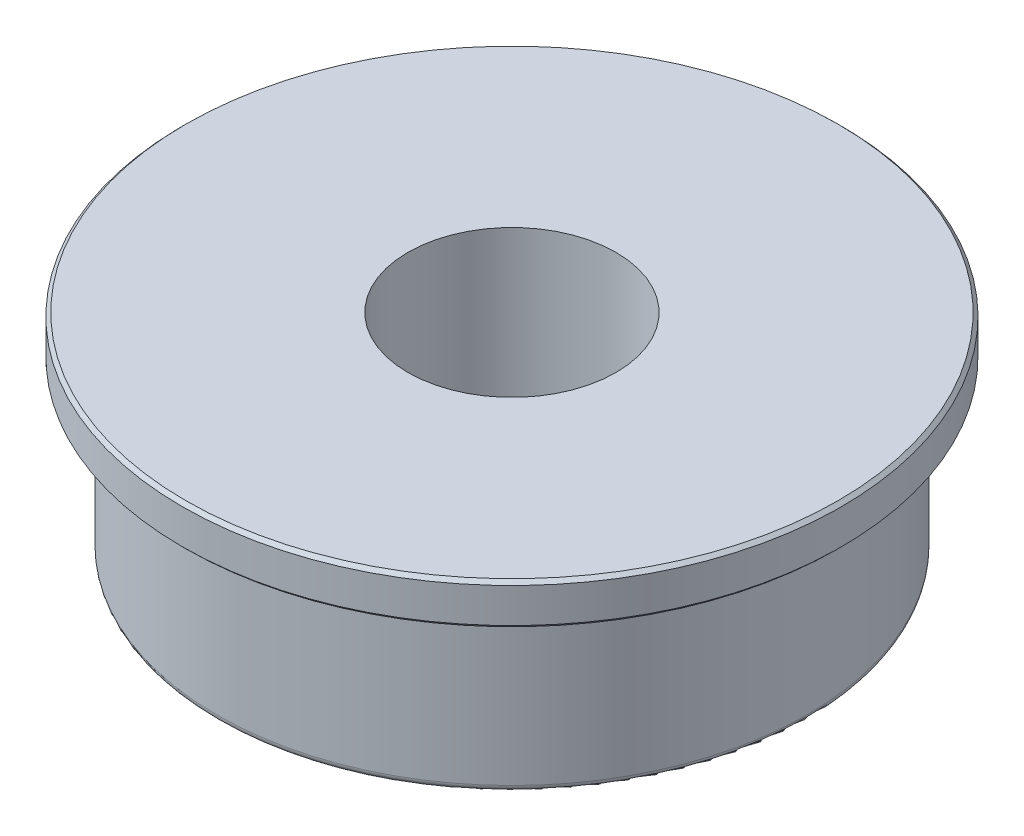
ISO-10303-21;
HEADER;
FILE_DESCRIPTION(('STEP AP214'),'2;1');
FILE_NAME('part.step','',(''),(''),'','','');
FILE_SCHEMA(('AUTOMOTIVE_DESIGN { 1 0 10303 214 1 1 1 1 }'));
ENDSEC;
DATA;
#1=APPLICATION_CONTEXT('core data for automotive mechanical design processes');
#2=APPLICATION_PROTOCOL_DEFINITION('international standard','automotive_design',2000,#1);
#3=PRODUCT_CONTEXT('',#1,'mechanical');
#4=PRODUCT('Part','Part','',(#3));
#5=PRODUCT_RELATED_PRODUCT_CATEGORY('part','',(#4));
#6=PRODUCT_DEFINITION_FORMATION('','',#4);
#7=PRODUCT_DEFINITION_CONTEXT('part definition',#1,'design');
#8=PRODUCT_DEFINITION('design','',#6,#7);
#9=PRODUCT_DEFINITION_SHAPE('','',#8);
#10=(LENGTH_UNIT() NAMED_UNIT(*) SI_UNIT(.MILLI.,.METRE.));
#11=(NAMED_UNIT(*) PLANE_ANGLE_UNIT() SI_UNIT($,.RADIAN.));
#12=(NAMED_UNIT(*) SI_UNIT($,.STERADIAN.) SOLID_ANGLE_UNIT());
#13=UNCERTAINTY_MEASURE_WITH_UNIT(LENGTH_MEASURE(1.E-05),#10,'distance_accuracy_value','');
#14=(GEOMETRIC_REPRESENTATION_CONTEXT(3) GLOBAL_UNCERTAINTY_ASSIGNED_CONTEXT((#13)) GLOBAL_UNIT_ASSIGNED_CONTEXT((#10,
#11,#12)) REPRESENTATION_CONTEXT('',''));
#15=CARTESIAN_POINT('',(0.,0.,0.));
#16=DIRECTION('',(0.,0.,1.));
#17=DIRECTION('',(1.,0.,0.));
#18=AXIS2_PLACEMENT_3D('',#15,#16,#17);
#19=CARTESIAN_POINT('',(0.,6.,0.));
#20=DIRECTION('',(0.,-1.,0.));
#21=DIRECTION('',(0.,0.,-1.));
#22=AXIS2_PLACEMENT_3D('',#19,#20,#21);
#23=CYLINDRICAL_SURFACE('',#22,8.5);
#24=CARTESIAN_POINT('',(0.,0.2,0.));
#25=DIRECTION('',(0.,1.,0.));
#26=DIRECTION('',(0.,0.,1.));
#27=AXIS2_PLACEMENT_3D('',#24,#25,#26);
#28=CIRCLE('',#27,8.5);
#29=CARTESIAN_POINT('',(0.,0.2,8.5));
#30=VERTEX_POINT('',#29);
#31=EDGE_CURVE('E68',#30,#30,#28,.T.);
#32=ORIENTED_EDGE('',*,*,#31,.T.);
#33=EDGE_LOOP('',(#32));
#34=FACE_BOUND('',#33,.T.);
#35=CARTESIAN_POINT('',(0.,4.8,0.));
#36=DIRECTION('',(0.,1.,0.));
#37=DIRECTION('',(0.,0.,1.));
#38=AXIS2_PLACEMENT_3D('',#35,#36,#37);
#39=CIRCLE('',#38,8.5);
#40=CARTESIAN_POINT('',(0.,4.8,8.5));
#41=VERTEX_POINT('',#40);
#42=EDGE_CURVE('E72',#41,#41,#39,.T.);
#43=ORIENTED_EDGE('',*,*,#42,.F.);
#44=EDGE_LOOP('',(#43));
#45=FACE_BOUND('',#44,.T.);
#46=ADVANCED_FACE('F39',(#34,#45),#23,.T.);
#47=CARTESIAN_POINT('',(0.,6.,0.));
#48=DIRECTION('',(0.,1.,0.));
#49=DIRECTION('',(0.,0.,1.));
#50=AXIS2_PLACEMENT_3D('',#47,#48,#49);
#51=PLANE('',#50);
#52=CARTESIAN_POINT('',(0.,6.,0.));
#53=DIRECTION('',(0.,1.,0.));
#54=DIRECTION('',(0.,0.,1.));
#55=AXIS2_PLACEMENT_3D('',#52,#53,#54);
#56=CIRCLE('',#55,9.40000000000001);
#57=CARTESIAN_POINT('',(0.,6.,9.40000000000001));
#58=VERTEX_POINT('',#57);
#59=EDGE_CURVE('E10',#58,#58,#56,.T.);
#60=ORIENTED_EDGE('',*,*,#59,.T.);
#61=EDGE_LOOP('',(#60));
#62=FACE_BOUND('',#61,.T.);
#63=CARTESIAN_POINT('',(0.,6.,0.));
#64=DIRECTION('',(0.,1.,0.));
#65=DIRECTION('',(0.,0.,1.));
#66=AXIS2_PLACEMENT_3D('',#63,#64,#65);
#67=CIRCLE('',#66,3.);
#68=CARTESIAN_POINT('',(0.,6.,3.));
#69=VERTEX_POINT('',#68);
#70=EDGE_CURVE('E77',#69,#69,#67,.T.);
#71=ORIENTED_EDGE('',*,*,#70,.F.);
#72=EDGE_LOOP('',(#71));
#73=FACE_BOUND('',#72,.T.);
#74=ADVANCED_FACE('F88',(#62,#73),#51,.T.);
#75=CARTESIAN_POINT('',(0.,0.,0.));
#76=DIRECTION('',(0.,1.,0.));
#77=DIRECTION('',(0.,0.,1.));
#78=AXIS2_PLACEMENT_3D('',#75,#76,#77);
#79=PLANE('',#78);
#80=CARTESIAN_POINT('',(0.,0.,0.));
#81=DIRECTION('',(0.,1.,0.));
#82=DIRECTION('',(0.,0.,1.));
#83=AXIS2_PLACEMENT_3D('',#80,#81,#82);
#84=CIRCLE('',#83,8.3);
#85=CARTESIAN_POINT('',(0.,0.,8.3));
#86=VERTEX_POINT('',#85);
#87=EDGE_CURVE('E64',#86,#86,#84,.F.);
#88=ORIENTED_EDGE('',*,*,#87,.T.);
#89=EDGE_LOOP('',(#88));
#90=FACE_BOUND('',#89,.T.);
#91=CARTESIAN_POINT('',(0.,0.,0.));
#92=DIRECTION('',(0.,1.,0.));
#93=DIRECTION('',(0.,0.,1.));
#94=AXIS2_PLACEMENT_3D('',#91,#92,#93);
#95=CIRCLE('',#94,3.);
#96=CARTESIAN_POINT('',(0.,0.,3.));
#97=VERTEX_POINT('',#96);
#98=EDGE_CURVE('E73',#97,#97,#95,.T.);
#99=ORIENTED_EDGE('',*,*,#98,.T.);
#100=EDGE_LOOP('',(#99));
#101=FACE_BOUND('',#100,.T.);
#102=ADVANCED_FACE('F94',(#90,#101),#79,.F.);
#103=CARTESIAN_POINT('',(0.,6.,0.));
#104=DIRECTION('',(0.,-1.,0.));
#105=DIRECTION('',(0.,0.,-1.));
#106=AXIS2_PLACEMENT_3D('',#103,#104,#105);
#107=CYLINDRICAL_SURFACE('',#106,3.);
#108=ORIENTED_EDGE('',*,*,#70,.T.);
#109=EDGE_LOOP('',(#108));
#110=FACE_BOUND('',#109,.T.);
#111=ORIENTED_EDGE('',*,*,#98,.F.);
#112=EDGE_LOOP('',(#111));
#113=FACE_BOUND('',#112,.T.);
#114=ADVANCED_FACE('F123',(#110,#113),#107,.F.);
#115=CARTESIAN_POINT('',(0.,4.8,0.));
#116=DIRECTION('',(0.,1.,0.));
#117=DIRECTION('',(0.,0.,1.));
#118=AXIS2_PLACEMENT_3D('',#115,#116,#117);
#119=PLANE('',#118);
#120=CARTESIAN_POINT('',(0.,4.8,0.));
#121=DIRECTION('',(0.,1.,0.));
#122=DIRECTION('',(0.,0.,1.));
#123=AXIS2_PLACEMENT_3D('',#120,#121,#122);
#124=CIRCLE('',#123,9.4);
#125=CARTESIAN_POINT('',(0.,4.8,9.4));
#126=VERTEX_POINT('',#125);
#127=EDGE_CURVE('E48',#126,#126,#124,.F.);
#128=ORIENTED_EDGE('',*,*,#127,.T.);
#129=EDGE_LOOP('',(#128));
#130=FACE_BOUND('',#129,.T.);
#131=ORIENTED_EDGE('',*,*,#42,.T.);
#132=EDGE_LOOP('',(#131));
#133=FACE_BOUND('',#132,.T.);
#134=ADVANCED_FACE('F85',(#130,#133),#119,.F.);
#135=CARTESIAN_POINT('',(0.,4.8,0.));
#136=DIRECTION('',(0.,1.,0.));
#137=DIRECTION('',(0.,0.,1.));
#138=AXIS2_PLACEMENT_3D('',#135,#136,#137);
#139=CYLINDRICAL_SURFACE('',#138,9.5);
#140=CARTESIAN_POINT('',(0.,4.9,0.));
#141=DIRECTION('',(0.,1.,0.));
#142=DIRECTION('',(0.,0.,1.));
#143=AXIS2_PLACEMENT_3D('',#140,#141,#142);
#144=CIRCLE('',#143,9.5);
#145=CARTESIAN_POINT('',(0.,4.9,9.5));
#146=VERTEX_POINT('',#145);
#147=EDGE_CURVE('E53',#146,#146,#144,.T.);
#148=ORIENTED_EDGE('',*,*,#147,.T.);
#149=EDGE_LOOP('',(#148));
#150=FACE_BOUND('',#149,.T.);
#151=CARTESIAN_POINT('',(0.,5.90000000000001,0.));
#152=DIRECTION('',(0.,1.,0.));
#153=DIRECTION('',(0.,0.,1.));
#154=AXIS2_PLACEMENT_3D('',#151,#152,#153);
#155=CIRCLE('',#154,9.5);
#156=CARTESIAN_POINT('',(0.,5.90000000000001,9.5));
#157=VERTEX_POINT('',#156);
#158=EDGE_CURVE('E58',#157,#157,#155,.F.);
#159=ORIENTED_EDGE('',*,*,#158,.T.);
#160=EDGE_LOOP('',(#159));
#161=FACE_BOUND('',#160,.T.);
#162=ADVANCED_FACE('F101',(#150,#161),#139,.T.);
#163=CARTESIAN_POINT('',(0.,0.2,0.));
#164=DIRECTION('',(0.,1.,0.));
#165=DIRECTION('',(0.,0.,1.));
#166=AXIS2_PLACEMENT_3D('',#163,#164,#165);
#167=TOROIDAL_SURFACE('',#166,8.3,0.2);
#168=ORIENTED_EDGE('',*,*,#87,.F.);
#169=EDGE_LOOP('',(#168));
#170=FACE_BOUND('',#169,.T.);
#171=ORIENTED_EDGE('',*,*,#31,.F.);
#172=EDGE_LOOP('',(#171));
#173=FACE_BOUND('',#172,.T.);
#174=ADVANCED_FACE('F98',(#170,#173),#167,.T.);
#175=CARTESIAN_POINT('',(0.,4.9,0.));
#176=DIRECTION('',(0.,1.,0.));
#177=DIRECTION('',(0.,0.,1.));
#178=AXIS2_PLACEMENT_3D('',#175,#176,#177);
#179=CONICAL_SURFACE('',#178,9.5,0.78539816339744);
#180=ORIENTED_EDGE('',*,*,#127,.F.);
#181=EDGE_LOOP('',(#180));
#182=FACE_BOUND('',#181,.T.);
#183=ORIENTED_EDGE('',*,*,#147,.F.);
#184=EDGE_LOOP('',(#183));
#185=FACE_BOUND('',#184,.T.);
#186=ADVANCED_FACE('F100',(#182,#185),#179,.T.);
#187=CARTESIAN_POINT('',(0.,6.,0.));
#188=DIRECTION('',(0.,-1.,0.));
#189=DIRECTION('',(0.,0.,-1.));
#190=AXIS2_PLACEMENT_3D('',#187,#188,#189);
#191=CONICAL_SURFACE('',#190,9.40000000000001,0.785398163397457);
#192=ORIENTED_EDGE('',*,*,#158,.F.);
#193=EDGE_LOOP('',(#192));
#194=FACE_BOUND('',#193,.T.);
#195=ORIENTED_EDGE('',*,*,#59,.F.);
#196=EDGE_LOOP('',(#195));
#197=FACE_BOUND('',#196,.T.);
#198=ADVANCED_FACE('F42',(#194,#197),#191,.T.);
#199=CLOSED_SHELL('',(#46,#74,#102,#114,#134,#162,#174,#186,#198));
#200=MANIFOLD_SOLID_BREP('B2',#199);
#201=ADVANCED_BREP_SHAPE_REPRESENTATION('',(#18,#200),#14);
#202=SHAPE_DEFINITION_REPRESENTATION(#9,#201);
ENDSEC;
END-ISO-10303-21;
